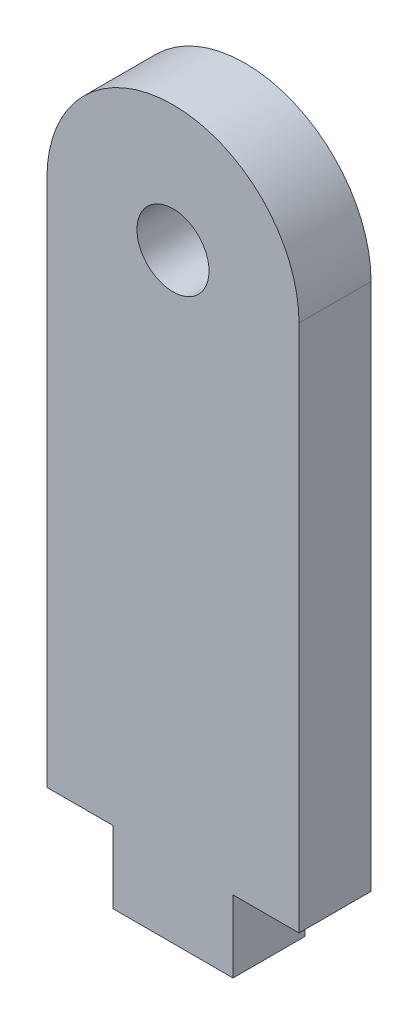
ISO-10303-21;
HEADER;
FILE_DESCRIPTION(('STEP AP214'),'2;1');
FILE_NAME('part.step','',(''),(''),'','','');
FILE_SCHEMA(('AUTOMOTIVE_DESIGN { 1 0 10303 214 1 1 1 1 }'));
ENDSEC;
DATA;
#1=APPLICATION_CONTEXT('core data for automotive mechanical design processes');
#2=APPLICATION_PROTOCOL_DEFINITION('international standard','automotive_design',2000,#1);
#3=PRODUCT_CONTEXT('',#1,'mechanical');
#4=PRODUCT('Part','Part','',(#3));
#5=PRODUCT_RELATED_PRODUCT_CATEGORY('part','',(#4));
#6=PRODUCT_DEFINITION_FORMATION('','',#4);
#7=PRODUCT_DEFINITION_CONTEXT('part definition',#1,'design');
#8=PRODUCT_DEFINITION('design','',#6,#7);
#9=PRODUCT_DEFINITION_SHAPE('','',#8);
#10=(LENGTH_UNIT() NAMED_UNIT(*) SI_UNIT(.MILLI.,.METRE.));
#11=(NAMED_UNIT(*) PLANE_ANGLE_UNIT() SI_UNIT($,.RADIAN.));
#12=(NAMED_UNIT(*) SI_UNIT($,.STERADIAN.) SOLID_ANGLE_UNIT());
#13=UNCERTAINTY_MEASURE_WITH_UNIT(LENGTH_MEASURE(1.E-05),#10,'distance_accuracy_value','');
#14=(GEOMETRIC_REPRESENTATION_CONTEXT(3) GLOBAL_UNCERTAINTY_ASSIGNED_CONTEXT((#13)) GLOBAL_UNIT_ASSIGNED_CONTEXT((#10,
#11,#12)) REPRESENTATION_CONTEXT('',''));
#15=CARTESIAN_POINT('',(0.,0.,0.));
#16=DIRECTION('',(0.,0.,1.));
#17=DIRECTION('',(1.,0.,0.));
#18=AXIS2_PLACEMENT_3D('',#15,#16,#17);
#19=CARTESIAN_POINT('',(5.25,25.,3.));
#20=DIRECTION('',(0.,0.,-1.));
#21=DIRECTION('',(-1.,0.,0.));
#22=AXIS2_PLACEMENT_3D('',#19,#20,#21);
#23=PLANE('',#22);
#24=CARTESIAN_POINT('',(5.25,25.,3.));
#25=DIRECTION('',(0.,0.,1.));
#26=DIRECTION('',(-1.,0.,0.));
#27=AXIS2_PLACEMENT_3D('',#24,#25,#26);
#28=CIRCLE('',#27,5.25);
#29=CARTESIAN_POINT('',(10.5,25.,3.));
#30=VERTEX_POINT('',#29);
#31=CARTESIAN_POINT('',(0.,25.,3.));
#32=VERTEX_POINT('',#31);
#33=EDGE_CURVE('E102',#30,#32,#28,.T.);
#34=ORIENTED_EDGE('',*,*,#33,.T.);
#35=DIRECTION('',(0.,-1.,0.));
#36=VECTOR('',#35,1.);
#37=CARTESIAN_POINT('',(0.,3.,3.));
#38=LINE('',#37,#36);
#39=CARTESIAN_POINT('',(0.,3.,3.));
#40=VERTEX_POINT('',#39);
#41=EDGE_CURVE('E187',#32,#40,#38,.T.);
#42=ORIENTED_EDGE('',*,*,#41,.T.);
#43=DIRECTION('',(1.,0.,0.));
#44=VECTOR('',#43,1.);
#45=CARTESIAN_POINT('',(2.75,3.,3.));
#46=LINE('',#45,#44);
#47=CARTESIAN_POINT('',(2.75,3.,3.));
#48=VERTEX_POINT('',#47);
#49=EDGE_CURVE('E170',#40,#48,#46,.T.);
#50=ORIENTED_EDGE('',*,*,#49,.T.);
#51=DIRECTION('',(0.,-1.,0.));
#52=VECTOR('',#51,1.);
#53=CARTESIAN_POINT('',(2.75,0.,3.));
#54=LINE('',#53,#52);
#55=CARTESIAN_POINT('',(2.75,0.,3.));
#56=VERTEX_POINT('',#55);
#57=EDGE_CURVE('E183',#48,#56,#54,.T.);
#58=ORIENTED_EDGE('',*,*,#57,.T.);
#59=DIRECTION('',(1.,0.,0.));
#60=VECTOR('',#59,1.);
#61=CARTESIAN_POINT('',(7.75,0.,3.));
#62=LINE('',#61,#60);
#63=CARTESIAN_POINT('',(7.75,0.,3.));
#64=VERTEX_POINT('',#63);
#65=EDGE_CURVE('E122',#56,#64,#62,.T.);
#66=ORIENTED_EDGE('',*,*,#65,.T.);
#67=DIRECTION('',(0.,1.,0.));
#68=VECTOR('',#67,1.);
#69=CARTESIAN_POINT('',(7.75,3.,3.));
#70=LINE('',#69,#68);
#71=CARTESIAN_POINT('',(7.75,3.,3.));
#72=VERTEX_POINT('',#71);
#73=EDGE_CURVE('E116',#64,#72,#70,.T.);
#74=ORIENTED_EDGE('',*,*,#73,.T.);
#75=DIRECTION('',(1.,0.,0.));
#76=VECTOR('',#75,1.);
#77=CARTESIAN_POINT('',(10.5,3.,3.));
#78=LINE('',#77,#76);
#79=CARTESIAN_POINT('',(10.5,3.,3.));
#80=VERTEX_POINT('',#79);
#81=EDGE_CURVE('E120',#72,#80,#78,.T.);
#82=ORIENTED_EDGE('',*,*,#81,.T.);
#83=DIRECTION('',(0.,1.,0.));
#84=VECTOR('',#83,1.);
#85=CARTESIAN_POINT('',(10.5,25.,3.));
#86=LINE('',#85,#84);
#87=EDGE_CURVE('E60',#80,#30,#86,.T.);
#88=ORIENTED_EDGE('',*,*,#87,.T.);
#89=EDGE_LOOP('',(#34,#42,#50,#58,#66,#74,#82,#88));
#90=FACE_BOUND('',#89,.T.);
#91=CARTESIAN_POINT('',(5.25,25.,3.));
#92=DIRECTION('',(0.,0.,1.));
#93=DIRECTION('',(1.,0.,0.));
#94=AXIS2_PLACEMENT_3D('',#91,#92,#93);
#95=CIRCLE('',#94,1.5);
#96=CARTESIAN_POINT('',(6.75,25.,3.));
#97=VERTEX_POINT('',#96);
#98=EDGE_CURVE('E142',#97,#97,#95,.T.);
#99=ORIENTED_EDGE('',*,*,#98,.F.);
#100=EDGE_LOOP('',(#99));
#101=FACE_BOUND('',#100,.T.);
#102=ADVANCED_FACE('F43',(#90,#101),#23,.F.);
#103=CARTESIAN_POINT('',(5.25,25.,0.));
#104=DIRECTION('',(0.,0.,-1.));
#105=DIRECTION('',(-1.,0.,0.));
#106=AXIS2_PLACEMENT_3D('',#103,#104,#105);
#107=PLANE('',#106);
#108=CARTESIAN_POINT('',(5.25,25.,0.));
#109=DIRECTION('',(0.,0.,1.));
#110=DIRECTION('',(-1.,0.,0.));
#111=AXIS2_PLACEMENT_3D('',#108,#109,#110);
#112=CIRCLE('',#111,5.25);
#113=CARTESIAN_POINT('',(10.5,25.,0.));
#114=VERTEX_POINT('',#113);
#115=CARTESIAN_POINT('',(0.,25.,0.));
#116=VERTEX_POINT('',#115);
#117=EDGE_CURVE('E96',#114,#116,#112,.T.);
#118=ORIENTED_EDGE('',*,*,#117,.F.);
#119=DIRECTION('',(0.,1.,0.));
#120=VECTOR('',#119,1.);
#121=CARTESIAN_POINT('',(10.5,25.,0.));
#122=LINE('',#121,#120);
#123=CARTESIAN_POINT('',(10.5,3.,0.));
#124=VERTEX_POINT('',#123);
#125=EDGE_CURVE('E152',#124,#114,#122,.T.);
#126=ORIENTED_EDGE('',*,*,#125,.F.);
#127=DIRECTION('',(1.,0.,0.));
#128=VECTOR('',#127,1.);
#129=CARTESIAN_POINT('',(10.5,3.,0.));
#130=LINE('',#129,#128);
#131=CARTESIAN_POINT('',(7.75,3.,0.));
#132=VERTEX_POINT('',#131);
#133=EDGE_CURVE('E89',#132,#124,#130,.T.);
#134=ORIENTED_EDGE('',*,*,#133,.F.);
#135=DIRECTION('',(0.,1.,0.));
#136=VECTOR('',#135,1.);
#137=CARTESIAN_POINT('',(7.75,3.,0.));
#138=LINE('',#137,#136);
#139=CARTESIAN_POINT('',(7.75,0.,0.));
#140=VERTEX_POINT('',#139);
#141=EDGE_CURVE('E130',#140,#132,#138,.T.);
#142=ORIENTED_EDGE('',*,*,#141,.F.);
#143=DIRECTION('',(1.,0.,0.));
#144=VECTOR('',#143,1.);
#145=CARTESIAN_POINT('',(7.75,0.,0.));
#146=LINE('',#145,#144);
#147=CARTESIAN_POINT('',(2.75,0.,0.));
#148=VERTEX_POINT('',#147);
#149=EDGE_CURVE('E148',#148,#140,#146,.T.);
#150=ORIENTED_EDGE('',*,*,#149,.F.);
#151=DIRECTION('',(0.,-1.,0.));
#152=VECTOR('',#151,1.);
#153=CARTESIAN_POINT('',(2.75,0.,0.));
#154=LINE('',#153,#152);
#155=CARTESIAN_POINT('',(2.75,3.,0.));
#156=VERTEX_POINT('',#155);
#157=EDGE_CURVE('E146',#156,#148,#154,.T.);
#158=ORIENTED_EDGE('',*,*,#157,.F.);
#159=DIRECTION('',(1.,0.,0.));
#160=VECTOR('',#159,1.);
#161=CARTESIAN_POINT('',(2.75,3.,0.));
#162=LINE('',#161,#160);
#163=CARTESIAN_POINT('',(0.,3.,0.));
#164=VERTEX_POINT('',#163);
#165=EDGE_CURVE('E144',#164,#156,#162,.T.);
#166=ORIENTED_EDGE('',*,*,#165,.F.);
#167=DIRECTION('',(0.,-1.,0.));
#168=VECTOR('',#167,1.);
#169=CARTESIAN_POINT('',(0.,3.,0.));
#170=LINE('',#169,#168);
#171=EDGE_CURVE('E141',#116,#164,#170,.T.);
#172=ORIENTED_EDGE('',*,*,#171,.F.);
#173=EDGE_LOOP('',(#118,#126,#134,#142,#150,#158,#166,#172));
#174=FACE_BOUND('',#173,.T.);
#175=CARTESIAN_POINT('',(5.25,25.,0.));
#176=DIRECTION('',(0.,0.,1.));
#177=DIRECTION('',(1.,0.,0.));
#178=AXIS2_PLACEMENT_3D('',#175,#176,#177);
#179=CIRCLE('',#178,1.5);
#180=CARTESIAN_POINT('',(6.75,25.,0.));
#181=VERTEX_POINT('',#180);
#182=EDGE_CURVE('E190',#181,#181,#179,.T.);
#183=ORIENTED_EDGE('',*,*,#182,.T.);
#184=EDGE_LOOP('',(#183));
#185=FACE_BOUND('',#184,.T.);
#186=ADVANCED_FACE('F174',(#174,#185),#107,.T.);
#187=CARTESIAN_POINT('',(5.25,25.,3.));
#188=DIRECTION('',(0.,0.,-1.));
#189=DIRECTION('',(-1.,0.,0.));
#190=AXIS2_PLACEMENT_3D('',#187,#188,#189);
#191=CYLINDRICAL_SURFACE('',#190,5.25);
#192=ORIENTED_EDGE('',*,*,#117,.T.);
#193=DIRECTION('',(0.,0.,-1.));
#194=VECTOR('',#193,1.);
#195=CARTESIAN_POINT('',(0.,25.,3.));
#196=LINE('',#195,#194);
#197=EDGE_CURVE('E11',#32,#116,#196,.T.);
#198=ORIENTED_EDGE('',*,*,#197,.F.);
#199=ORIENTED_EDGE('',*,*,#33,.F.);
#200=DIRECTION('',(0.,0.,-1.));
#201=VECTOR('',#200,1.);
#202=CARTESIAN_POINT('',(10.5,25.,3.));
#203=LINE('',#202,#201);
#204=EDGE_CURVE('E136',#30,#114,#203,.T.);
#205=ORIENTED_EDGE('',*,*,#204,.T.);
#206=EDGE_LOOP('',(#192,#198,#199,#205));
#207=FACE_BOUND('',#206,.T.);
#208=ADVANCED_FACE('F45',(#207),#191,.T.);
#209=CARTESIAN_POINT('',(0.,3.,3.));
#210=DIRECTION('',(1.,0.,0.));
#211=DIRECTION('',(0.,0.,-1.));
#212=AXIS2_PLACEMENT_3D('',#209,#210,#211);
#213=PLANE('',#212);
#214=ORIENTED_EDGE('',*,*,#171,.T.);
#215=DIRECTION('',(0.,0.,-1.));
#216=VECTOR('',#215,1.);
#217=CARTESIAN_POINT('',(0.,3.,3.));
#218=LINE('',#217,#216);
#219=EDGE_CURVE('E52',#40,#164,#218,.T.);
#220=ORIENTED_EDGE('',*,*,#219,.F.);
#221=ORIENTED_EDGE('',*,*,#41,.F.);
#222=ORIENTED_EDGE('',*,*,#197,.T.);
#223=EDGE_LOOP('',(#214,#220,#221,#222));
#224=FACE_BOUND('',#223,.T.);
#225=ADVANCED_FACE('F218',(#224),#213,.F.);
#226=CARTESIAN_POINT('',(2.75,3.,3.));
#227=DIRECTION('',(0.,1.,0.));
#228=DIRECTION('',(0.,0.,1.));
#229=AXIS2_PLACEMENT_3D('',#226,#227,#228);
#230=PLANE('',#229);
#231=ORIENTED_EDGE('',*,*,#165,.T.);
#232=DIRECTION('',(0.,0.,-1.));
#233=VECTOR('',#232,1.);
#234=CARTESIAN_POINT('',(2.75,3.,3.));
#235=LINE('',#234,#233);
#236=EDGE_CURVE('E161',#48,#156,#235,.T.);
#237=ORIENTED_EDGE('',*,*,#236,.F.);
#238=ORIENTED_EDGE('',*,*,#49,.F.);
#239=ORIENTED_EDGE('',*,*,#219,.T.);
#240=EDGE_LOOP('',(#231,#237,#238,#239));
#241=FACE_BOUND('',#240,.T.);
#242=ADVANCED_FACE('F168',(#241),#230,.F.);
#243=CARTESIAN_POINT('',(2.75,0.,3.));
#244=DIRECTION('',(1.,0.,0.));
#245=DIRECTION('',(0.,1.,0.));
#246=AXIS2_PLACEMENT_3D('',#243,#244,#245);
#247=PLANE('',#246);
#248=ORIENTED_EDGE('',*,*,#157,.T.);
#249=DIRECTION('',(0.,0.,-1.));
#250=VECTOR('',#249,1.);
#251=CARTESIAN_POINT('',(2.75,0.,3.));
#252=LINE('',#251,#250);
#253=EDGE_CURVE('E158',#56,#148,#252,.T.);
#254=ORIENTED_EDGE('',*,*,#253,.F.);
#255=ORIENTED_EDGE('',*,*,#57,.F.);
#256=ORIENTED_EDGE('',*,*,#236,.T.);
#257=EDGE_LOOP('',(#248,#254,#255,#256));
#258=FACE_BOUND('',#257,.T.);
#259=ADVANCED_FACE('F179',(#258),#247,.F.);
#260=CARTESIAN_POINT('',(7.75,0.,3.));
#261=DIRECTION('',(0.,1.,0.));
#262=DIRECTION('',(0.,0.,1.));
#263=AXIS2_PLACEMENT_3D('',#260,#261,#262);
#264=PLANE('',#263);
#265=ORIENTED_EDGE('',*,*,#149,.T.);
#266=DIRECTION('',(0.,0.,-1.));
#267=VECTOR('',#266,1.);
#268=CARTESIAN_POINT('',(7.75,0.,3.));
#269=LINE('',#268,#267);
#270=EDGE_CURVE('E131',#64,#140,#269,.T.);
#271=ORIENTED_EDGE('',*,*,#270,.F.);
#272=ORIENTED_EDGE('',*,*,#65,.F.);
#273=ORIENTED_EDGE('',*,*,#253,.T.);
#274=EDGE_LOOP('',(#265,#271,#272,#273));
#275=FACE_BOUND('',#274,.T.);
#276=ADVANCED_FACE('F182',(#275),#264,.F.);
#277=CARTESIAN_POINT('',(7.75,3.,3.));
#278=DIRECTION('',(-1.,0.,0.));
#279=DIRECTION('',(0.,-1.,0.));
#280=AXIS2_PLACEMENT_3D('',#277,#278,#279);
#281=PLANE('',#280);
#282=ORIENTED_EDGE('',*,*,#141,.T.);
#283=DIRECTION('',(0.,0.,-1.));
#284=VECTOR('',#283,1.);
#285=CARTESIAN_POINT('',(7.75,3.,3.));
#286=LINE('',#285,#284);
#287=EDGE_CURVE('E127',#72,#132,#286,.T.);
#288=ORIENTED_EDGE('',*,*,#287,.F.);
#289=ORIENTED_EDGE('',*,*,#73,.F.);
#290=ORIENTED_EDGE('',*,*,#270,.T.);
#291=EDGE_LOOP('',(#282,#288,#289,#290));
#292=FACE_BOUND('',#291,.T.);
#293=ADVANCED_FACE('F128',(#292),#281,.F.);
#294=CARTESIAN_POINT('',(10.5,3.,3.));
#295=DIRECTION('',(0.,1.,0.));
#296=DIRECTION('',(0.,0.,1.));
#297=AXIS2_PLACEMENT_3D('',#294,#295,#296);
#298=PLANE('',#297);
#299=ORIENTED_EDGE('',*,*,#133,.T.);
#300=DIRECTION('',(0.,0.,-1.));
#301=VECTOR('',#300,1.);
#302=CARTESIAN_POINT('',(10.5,3.,3.));
#303=LINE('',#302,#301);
#304=EDGE_CURVE('E132',#80,#124,#303,.T.);
#305=ORIENTED_EDGE('',*,*,#304,.F.);
#306=ORIENTED_EDGE('',*,*,#81,.F.);
#307=ORIENTED_EDGE('',*,*,#287,.T.);
#308=EDGE_LOOP('',(#299,#305,#306,#307));
#309=FACE_BOUND('',#308,.T.);
#310=ADVANCED_FACE('F134',(#309),#298,.F.);
#311=CARTESIAN_POINT('',(10.5,25.,3.));
#312=DIRECTION('',(-1.,0.,0.));
#313=DIRECTION('',(0.,-1.,0.));
#314=AXIS2_PLACEMENT_3D('',#311,#312,#313);
#315=PLANE('',#314);
#316=ORIENTED_EDGE('',*,*,#125,.T.);
#317=ORIENTED_EDGE('',*,*,#204,.F.);
#318=ORIENTED_EDGE('',*,*,#87,.F.);
#319=ORIENTED_EDGE('',*,*,#304,.T.);
#320=EDGE_LOOP('',(#316,#317,#318,#319));
#321=FACE_BOUND('',#320,.T.);
#322=ADVANCED_FACE('F205',(#321),#315,.F.);
#323=CARTESIAN_POINT('',(5.25,25.,3.));
#324=DIRECTION('',(0.,0.,-1.));
#325=DIRECTION('',(-1.,0.,0.));
#326=AXIS2_PLACEMENT_3D('',#323,#324,#325);
#327=CYLINDRICAL_SURFACE('',#326,1.5);
#328=ORIENTED_EDGE('',*,*,#182,.F.);
#329=EDGE_LOOP('',(#328));
#330=FACE_BOUND('',#329,.T.);
#331=ORIENTED_EDGE('',*,*,#98,.T.);
#332=EDGE_LOOP('',(#331));
#333=FACE_BOUND('',#332,.T.);
#334=ADVANCED_FACE('F196',(#330,#333),#327,.F.);
#335=CLOSED_SHELL('',(#102,#186,#208,#225,#242,#259,#276,#293,#310,#322,#334));
#336=MANIFOLD_SOLID_BREP('B2',#335);
#337=ADVANCED_BREP_SHAPE_REPRESENTATION('',(#18,#336),#14);
#338=SHAPE_DEFINITION_REPRESENTATION(#9,#337);
ENDSEC;
END-ISO-10303-21;
